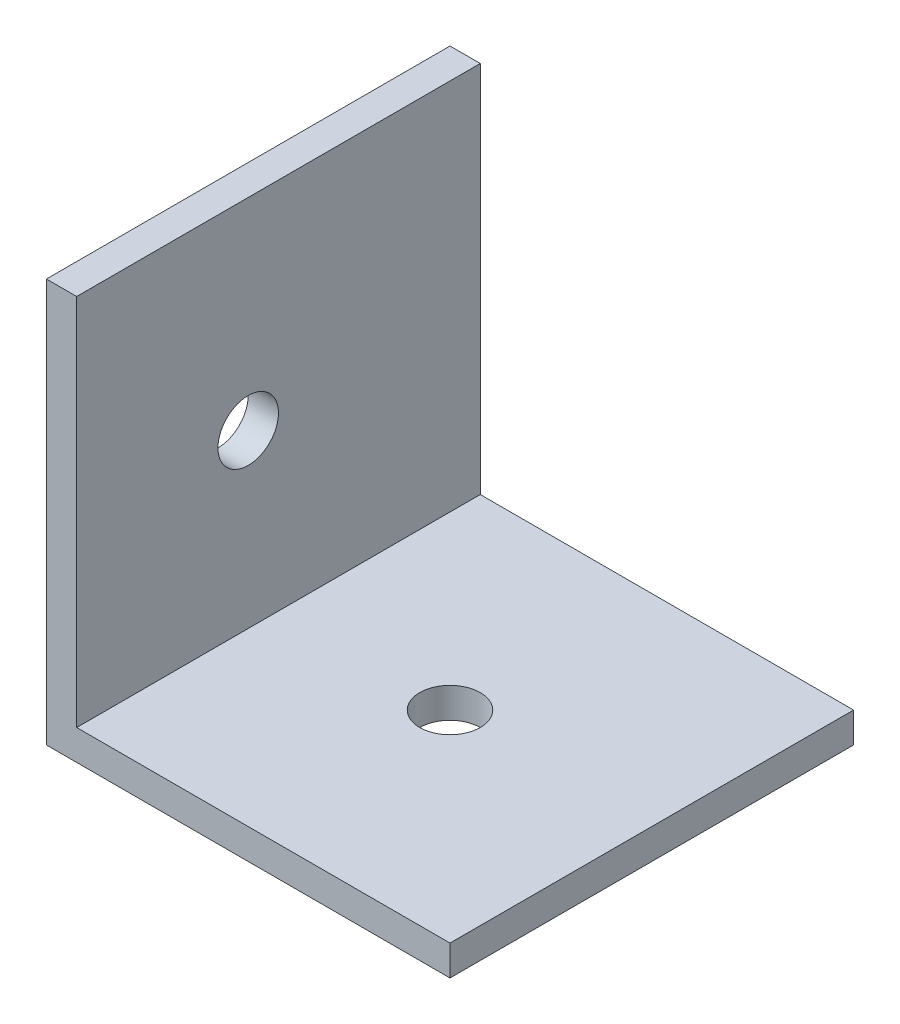
ISO-10303-21;
HEADER;
FILE_DESCRIPTION(('STEP AP214'),'2;1');
FILE_NAME('part.step','',(''),(''),'','','');
FILE_SCHEMA(('AUTOMOTIVE_DESIGN { 1 0 10303 214 1 1 1 1 }'));
ENDSEC;
DATA;
#1=APPLICATION_CONTEXT('core data for automotive mechanical design processes');
#2=APPLICATION_PROTOCOL_DEFINITION('international standard','automotive_design',2000,#1);
#3=PRODUCT_CONTEXT('',#1,'mechanical');
#4=PRODUCT('Part','Part','',(#3));
#5=PRODUCT_RELATED_PRODUCT_CATEGORY('part','',(#4));
#6=PRODUCT_DEFINITION_FORMATION('','',#4);
#7=PRODUCT_DEFINITION_CONTEXT('part definition',#1,'design');
#8=PRODUCT_DEFINITION('design','',#6,#7);
#9=PRODUCT_DEFINITION_SHAPE('','',#8);
#10=(LENGTH_UNIT() NAMED_UNIT(*) SI_UNIT(.MILLI.,.METRE.));
#11=(NAMED_UNIT(*) PLANE_ANGLE_UNIT() SI_UNIT($,.RADIAN.));
#12=(NAMED_UNIT(*) SI_UNIT($,.STERADIAN.) SOLID_ANGLE_UNIT());
#13=UNCERTAINTY_MEASURE_WITH_UNIT(LENGTH_MEASURE(1.E-05),#10,'distance_accuracy_value','');
#14=(GEOMETRIC_REPRESENTATION_CONTEXT(3) GLOBAL_UNCERTAINTY_ASSIGNED_CONTEXT((#13)) GLOBAL_UNIT_ASSIGNED_CONTEXT((#10,
#11,#12)) REPRESENTATION_CONTEXT('',''));
#15=CARTESIAN_POINT('',(0.,0.,0.));
#16=DIRECTION('',(0.,0.,1.));
#17=DIRECTION('',(1.,0.,0.));
#18=AXIS2_PLACEMENT_3D('',#15,#16,#17);
#19=CARTESIAN_POINT('',(0.,20.,20.));
#20=DIRECTION('',(1.,0.,0.));
#21=DIRECTION('',(0.,1.,0.));
#22=AXIS2_PLACEMENT_3D('',#19,#20,#21);
#23=PLANE('',#22);
#24=CARTESIAN_POINT('',(0.,10.,11.5));
#25=DIRECTION('',(1.,0.,0.));
#26=DIRECTION('',(0.,1.,0.));
#27=AXIS2_PLACEMENT_3D('',#24,#25,#26);
#28=CIRCLE('',#27,1.5);
#29=CARTESIAN_POINT('',(0.,11.5,11.5));
#30=VERTEX_POINT('',#29);
#31=EDGE_CURVE('E159',#30,#30,#28,.T.);
#32=ORIENTED_EDGE('',*,*,#31,.T.);
#33=EDGE_LOOP('',(#32));
#34=FACE_BOUND('',#33,.T.);
#35=DIRECTION('',(0.,-1.,0.));
#36=VECTOR('',#35,1.);
#37=CARTESIAN_POINT('',(0.,20.,0.));
#38=LINE('',#37,#36);
#39=CARTESIAN_POINT('',(0.,20.,0.));
#40=VERTEX_POINT('',#39);
#41=CARTESIAN_POINT('',(0.,0.,0.));
#42=VERTEX_POINT('',#41);
#43=EDGE_CURVE('E115',#40,#42,#38,.T.);
#44=ORIENTED_EDGE('',*,*,#43,.T.);
#45=DIRECTION('',(0.,0.,-1.));
#46=VECTOR('',#45,1.);
#47=CARTESIAN_POINT('',(0.,0.,20.));
#48=LINE('',#47,#46);
#49=CARTESIAN_POINT('',(0.,0.,20.));
#50=VERTEX_POINT('',#49);
#51=EDGE_CURVE('E11',#50,#42,#48,.T.);
#52=ORIENTED_EDGE('',*,*,#51,.F.);
#53=DIRECTION('',(0.,-1.,0.));
#54=VECTOR('',#53,1.);
#55=CARTESIAN_POINT('',(0.,20.,20.));
#56=LINE('',#55,#54);
#57=CARTESIAN_POINT('',(0.,20.,20.));
#58=VERTEX_POINT('',#57);
#59=EDGE_CURVE('E126',#58,#50,#56,.T.);
#60=ORIENTED_EDGE('',*,*,#59,.F.);
#61=DIRECTION('',(0.,0.,-1.));
#62=VECTOR('',#61,1.);
#63=CARTESIAN_POINT('',(0.,20.,20.));
#64=LINE('',#63,#62);
#65=EDGE_CURVE('E111',#58,#40,#64,.T.);
#66=ORIENTED_EDGE('',*,*,#65,.T.);
#67=EDGE_LOOP('',(#44,#52,#60,#66));
#68=FACE_BOUND('',#67,.T.);
#69=ADVANCED_FACE('F31',(#34,#68),#23,.F.);
#70=CARTESIAN_POINT('',(0.,0.,20.));
#71=DIRECTION('',(0.,1.,0.));
#72=DIRECTION('',(0.,0.,1.));
#73=AXIS2_PLACEMENT_3D('',#70,#71,#72);
#74=PLANE('',#73);
#75=CARTESIAN_POINT('',(10.,0.,10.));
#76=DIRECTION('',(0.,1.,0.));
#77=DIRECTION('',(-1.,0.,0.));
#78=AXIS2_PLACEMENT_3D('',#75,#76,#77);
#79=CIRCLE('',#78,1.5);
#80=CARTESIAN_POINT('',(8.5,0.,10.));
#81=VERTEX_POINT('',#80);
#82=EDGE_CURVE('E119',#81,#81,#79,.T.);
#83=ORIENTED_EDGE('',*,*,#82,.T.);
#84=EDGE_LOOP('',(#83));
#85=FACE_BOUND('',#84,.T.);
#86=DIRECTION('',(1.,0.,0.));
#87=VECTOR('',#86,1.);
#88=CARTESIAN_POINT('',(0.,0.,0.));
#89=LINE('',#88,#87);
#90=CARTESIAN_POINT('',(20.,0.,0.));
#91=VERTEX_POINT('',#90);
#92=EDGE_CURVE('E118',#42,#91,#89,.T.);
#93=ORIENTED_EDGE('',*,*,#92,.T.);
#94=DIRECTION('',(0.,0.,-1.));
#95=VECTOR('',#94,1.);
#96=CARTESIAN_POINT('',(20.,0.,20.));
#97=LINE('',#96,#95);
#98=CARTESIAN_POINT('',(20.,0.,20.));
#99=VERTEX_POINT('',#98);
#100=EDGE_CURVE('E39',#99,#91,#97,.T.);
#101=ORIENTED_EDGE('',*,*,#100,.F.);
#102=DIRECTION('',(1.,0.,0.));
#103=VECTOR('',#102,1.);
#104=CARTESIAN_POINT('',(0.,0.,20.));
#105=LINE('',#104,#103);
#106=EDGE_CURVE('E84',#50,#99,#105,.T.);
#107=ORIENTED_EDGE('',*,*,#106,.F.);
#108=ORIENTED_EDGE('',*,*,#51,.T.);
#109=EDGE_LOOP('',(#93,#101,#107,#108));
#110=FACE_BOUND('',#109,.T.);
#111=ADVANCED_FACE('F151',(#85,#110),#74,.F.);
#112=CARTESIAN_POINT('',(20.,0.,20.));
#113=DIRECTION('',(-1.,0.,0.));
#114=DIRECTION('',(0.,0.,1.));
#115=AXIS2_PLACEMENT_3D('',#112,#113,#114);
#116=PLANE('',#115);
#117=DIRECTION('',(0.,1.,0.));
#118=VECTOR('',#117,1.);
#119=CARTESIAN_POINT('',(20.,0.,0.));
#120=LINE('',#119,#118);
#121=CARTESIAN_POINT('',(20.,1.5,0.));
#122=VERTEX_POINT('',#121);
#123=EDGE_CURVE('E121',#91,#122,#120,.T.);
#124=ORIENTED_EDGE('',*,*,#123,.T.);
#125=DIRECTION('',(0.,0.,-1.));
#126=VECTOR('',#125,1.);
#127=CARTESIAN_POINT('',(20.,1.5,20.));
#128=LINE('',#127,#126);
#129=CARTESIAN_POINT('',(20.,1.5,20.));
#130=VERTEX_POINT('',#129);
#131=EDGE_CURVE('E106',#130,#122,#128,.T.);
#132=ORIENTED_EDGE('',*,*,#131,.F.);
#133=DIRECTION('',(0.,1.,0.));
#134=VECTOR('',#133,1.);
#135=CARTESIAN_POINT('',(20.,0.,20.));
#136=LINE('',#135,#134);
#137=EDGE_CURVE('E97',#99,#130,#136,.T.);
#138=ORIENTED_EDGE('',*,*,#137,.F.);
#139=ORIENTED_EDGE('',*,*,#100,.T.);
#140=EDGE_LOOP('',(#124,#132,#138,#139));
#141=FACE_BOUND('',#140,.T.);
#142=ADVANCED_FACE('F132',(#141),#116,.F.);
#143=CARTESIAN_POINT('',(20.,1.5,20.));
#144=DIRECTION('',(0.,-1.,0.));
#145=DIRECTION('',(1.,0.,0.));
#146=AXIS2_PLACEMENT_3D('',#143,#144,#145);
#147=PLANE('',#146);
#148=CARTESIAN_POINT('',(10.,1.5,10.));
#149=DIRECTION('',(0.,1.,0.));
#150=DIRECTION('',(-1.,0.,0.));
#151=AXIS2_PLACEMENT_3D('',#148,#149,#150);
#152=CIRCLE('',#151,1.5);
#153=CARTESIAN_POINT('',(8.5,1.5,10.));
#154=VERTEX_POINT('',#153);
#155=EDGE_CURVE('E161',#154,#154,#152,.T.);
#156=ORIENTED_EDGE('',*,*,#155,.F.);
#157=EDGE_LOOP('',(#156));
#158=FACE_BOUND('',#157,.T.);
#159=DIRECTION('',(-1.,0.,0.));
#160=VECTOR('',#159,1.);
#161=CARTESIAN_POINT('',(20.,1.5,0.));
#162=LINE('',#161,#160);
#163=CARTESIAN_POINT('',(1.5,1.5,0.));
#164=VERTEX_POINT('',#163);
#165=EDGE_CURVE('E105',#122,#164,#162,.T.);
#166=ORIENTED_EDGE('',*,*,#165,.T.);
#167=DIRECTION('',(0.,0.,-1.));
#168=VECTOR('',#167,1.);
#169=CARTESIAN_POINT('',(1.5,1.5,20.));
#170=LINE('',#169,#168);
#171=CARTESIAN_POINT('',(1.5,1.5,20.));
#172=VERTEX_POINT('',#171);
#173=EDGE_CURVE('E102',#172,#164,#170,.T.);
#174=ORIENTED_EDGE('',*,*,#173,.F.);
#175=DIRECTION('',(-1.,0.,0.));
#176=VECTOR('',#175,1.);
#177=CARTESIAN_POINT('',(20.,1.5,20.));
#178=LINE('',#177,#176);
#179=EDGE_CURVE('E91',#130,#172,#178,.T.);
#180=ORIENTED_EDGE('',*,*,#179,.F.);
#181=ORIENTED_EDGE('',*,*,#131,.T.);
#182=EDGE_LOOP('',(#166,#174,#180,#181));
#183=FACE_BOUND('',#182,.T.);
#184=ADVANCED_FACE('F103',(#158,#183),#147,.F.);
#185=CARTESIAN_POINT('',(1.5,1.5,20.));
#186=DIRECTION('',(-1.,0.,0.));
#187=DIRECTION('',(0.,-1.,0.));
#188=AXIS2_PLACEMENT_3D('',#185,#186,#187);
#189=PLANE('',#188);
#190=CARTESIAN_POINT('',(1.5,10.,11.5));
#191=DIRECTION('',(1.,0.,0.));
#192=DIRECTION('',(0.,1.,0.));
#193=AXIS2_PLACEMENT_3D('',#190,#191,#192);
#194=CIRCLE('',#193,1.5);
#195=CARTESIAN_POINT('',(1.5,11.5,11.5));
#196=VERTEX_POINT('',#195);
#197=EDGE_CURVE('E162',#196,#196,#194,.T.);
#198=ORIENTED_EDGE('',*,*,#197,.F.);
#199=EDGE_LOOP('',(#198));
#200=FACE_BOUND('',#199,.T.);
#201=DIRECTION('',(0.,1.,0.));
#202=VECTOR('',#201,1.);
#203=CARTESIAN_POINT('',(1.5,1.5,0.));
#204=LINE('',#203,#202);
#205=CARTESIAN_POINT('',(1.5,20.,0.));
#206=VERTEX_POINT('',#205);
#207=EDGE_CURVE('E70',#164,#206,#204,.T.);
#208=ORIENTED_EDGE('',*,*,#207,.T.);
#209=DIRECTION('',(0.,0.,-1.));
#210=VECTOR('',#209,1.);
#211=CARTESIAN_POINT('',(1.5,20.,20.));
#212=LINE('',#211,#210);
#213=CARTESIAN_POINT('',(1.5,20.,20.));
#214=VERTEX_POINT('',#213);
#215=EDGE_CURVE('E107',#214,#206,#212,.T.);
#216=ORIENTED_EDGE('',*,*,#215,.F.);
#217=DIRECTION('',(0.,1.,0.));
#218=VECTOR('',#217,1.);
#219=CARTESIAN_POINT('',(1.5,1.5,20.));
#220=LINE('',#219,#218);
#221=EDGE_CURVE('E95',#172,#214,#220,.T.);
#222=ORIENTED_EDGE('',*,*,#221,.F.);
#223=ORIENTED_EDGE('',*,*,#173,.T.);
#224=EDGE_LOOP('',(#208,#216,#222,#223));
#225=FACE_BOUND('',#224,.T.);
#226=ADVANCED_FACE('F109',(#200,#225),#189,.F.);
#227=CARTESIAN_POINT('',(1.5,20.,20.));
#228=DIRECTION('',(0.,-1.,0.));
#229=DIRECTION('',(0.,0.,-1.));
#230=AXIS2_PLACEMENT_3D('',#227,#228,#229);
#231=PLANE('',#230);
#232=DIRECTION('',(-1.,0.,0.));
#233=VECTOR('',#232,1.);
#234=CARTESIAN_POINT('',(1.5,20.,0.));
#235=LINE('',#234,#233);
#236=EDGE_CURVE('E76',#206,#40,#235,.T.);
#237=ORIENTED_EDGE('',*,*,#236,.T.);
#238=ORIENTED_EDGE('',*,*,#65,.F.);
#239=DIRECTION('',(-1.,0.,0.));
#240=VECTOR('',#239,1.);
#241=CARTESIAN_POINT('',(1.5,20.,20.));
#242=LINE('',#241,#240);
#243=EDGE_CURVE('E47',#214,#58,#242,.T.);
#244=ORIENTED_EDGE('',*,*,#243,.F.);
#245=ORIENTED_EDGE('',*,*,#215,.T.);
#246=EDGE_LOOP('',(#237,#238,#244,#245));
#247=FACE_BOUND('',#246,.T.);
#248=ADVANCED_FACE('F139',(#247),#231,.F.);
#249=CARTESIAN_POINT('',(0.,0.,20.));
#250=DIRECTION('',(0.,0.,1.));
#251=DIRECTION('',(1.,0.,0.));
#252=AXIS2_PLACEMENT_3D('',#249,#250,#251);
#253=PLANE('',#252);
#254=ORIENTED_EDGE('',*,*,#59,.T.);
#255=ORIENTED_EDGE('',*,*,#106,.T.);
#256=ORIENTED_EDGE('',*,*,#137,.T.);
#257=ORIENTED_EDGE('',*,*,#179,.T.);
#258=ORIENTED_EDGE('',*,*,#221,.T.);
#259=ORIENTED_EDGE('',*,*,#243,.T.);
#260=EDGE_LOOP('',(#254,#255,#256,#257,#258,#259));
#261=FACE_BOUND('',#260,.T.);
#262=ADVANCED_FACE('F93',(#261),#253,.T.);
#263=CARTESIAN_POINT('',(0.,0.,0.));
#264=DIRECTION('',(0.,0.,1.));
#265=DIRECTION('',(1.,0.,0.));
#266=AXIS2_PLACEMENT_3D('',#263,#264,#265);
#267=PLANE('',#266);
#268=ORIENTED_EDGE('',*,*,#43,.F.);
#269=ORIENTED_EDGE('',*,*,#236,.F.);
#270=ORIENTED_EDGE('',*,*,#207,.F.);
#271=ORIENTED_EDGE('',*,*,#165,.F.);
#272=ORIENTED_EDGE('',*,*,#123,.F.);
#273=ORIENTED_EDGE('',*,*,#92,.F.);
#274=EDGE_LOOP('',(#268,#269,#270,#271,#272,#273));
#275=FACE_BOUND('',#274,.T.);
#276=ADVANCED_FACE('F135',(#275),#267,.F.);
#277=CARTESIAN_POINT('',(10.,0.,10.));
#278=DIRECTION('',(0.,1.,0.));
#279=DIRECTION('',(-1.,0.,0.));
#280=AXIS2_PLACEMENT_3D('',#277,#278,#279);
#281=CYLINDRICAL_SURFACE('',#280,1.5);
#282=ORIENTED_EDGE('',*,*,#82,.F.);
#283=EDGE_LOOP('',(#282));
#284=FACE_BOUND('',#283,.T.);
#285=ORIENTED_EDGE('',*,*,#155,.T.);
#286=EDGE_LOOP('',(#285));
#287=FACE_BOUND('',#286,.T.);
#288=ADVANCED_FACE('F174',(#284,#287),#281,.F.);
#289=CARTESIAN_POINT('',(0.,10.,11.5));
#290=DIRECTION('',(1.,0.,0.));
#291=DIRECTION('',(0.,1.,0.));
#292=AXIS2_PLACEMENT_3D('',#289,#290,#291);
#293=CYLINDRICAL_SURFACE('',#292,1.5);
#294=ORIENTED_EDGE('',*,*,#31,.F.);
#295=EDGE_LOOP('',(#294));
#296=FACE_BOUND('',#295,.T.);
#297=ORIENTED_EDGE('',*,*,#197,.T.);
#298=EDGE_LOOP('',(#297));
#299=FACE_BOUND('',#298,.T.);
#300=ADVANCED_FACE('F177',(#296,#299),#293,.F.);
#301=CLOSED_SHELL('',(#69,#111,#142,#184,#226,#248,#262,#276,#288,#300));
#302=MANIFOLD_SOLID_BREP('B2',#301);
#303=ADVANCED_BREP_SHAPE_REPRESENTATION('',(#18,#302),#14);
#304=SHAPE_DEFINITION_REPRESENTATION(#9,#303);
ENDSEC;
END-ISO-10303-21;
